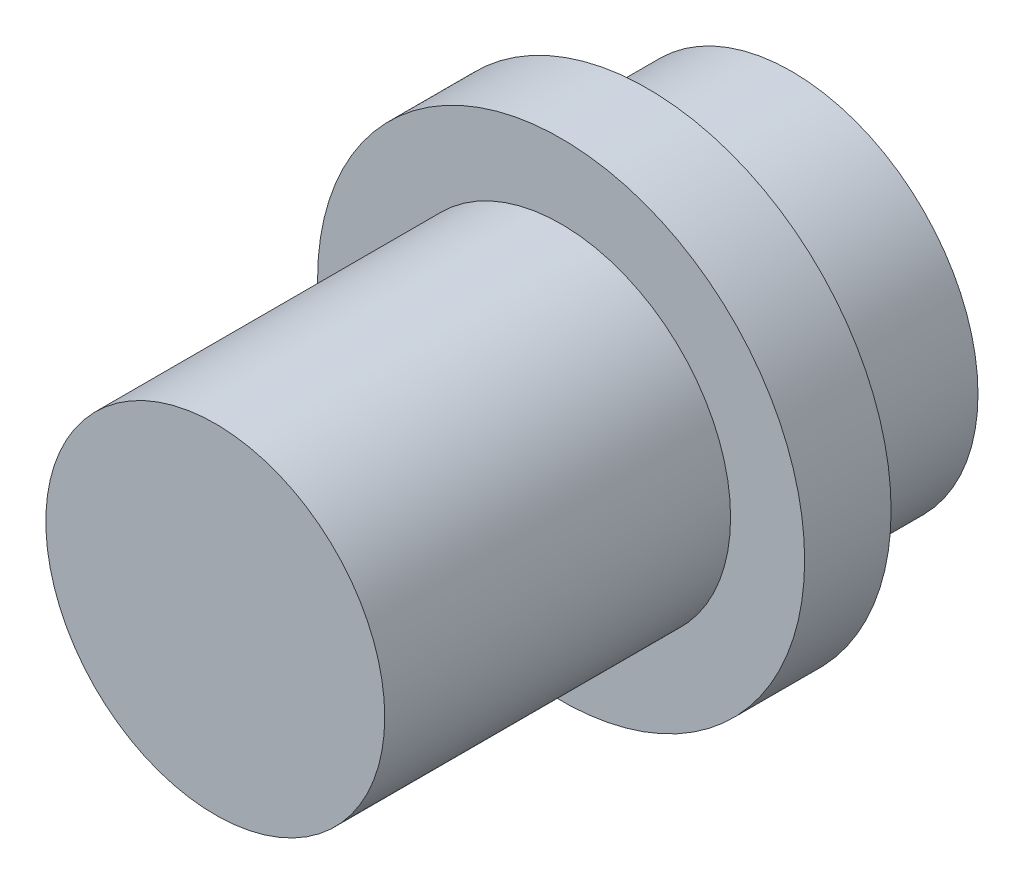
ISO-10303-21;
HEADER;
FILE_DESCRIPTION(('STEP AP214'),'2;1');
FILE_NAME('part.step','',(''),(''),'','','');
FILE_SCHEMA(('AUTOMOTIVE_DESIGN { 1 0 10303 214 1 1 1 1 }'));
ENDSEC;
DATA;
#1=APPLICATION_CONTEXT('core data for automotive mechanical design processes');
#2=APPLICATION_PROTOCOL_DEFINITION('international standard','automotive_design',2000,#1);
#3=PRODUCT_CONTEXT('',#1,'mechanical');
#4=PRODUCT('Part','Part','',(#3));
#5=PRODUCT_RELATED_PRODUCT_CATEGORY('part','',(#4));
#6=PRODUCT_DEFINITION_FORMATION('','',#4);
#7=PRODUCT_DEFINITION_CONTEXT('part definition',#1,'design');
#8=PRODUCT_DEFINITION('design','',#6,#7);
#9=PRODUCT_DEFINITION_SHAPE('','',#8);
#10=(LENGTH_UNIT() NAMED_UNIT(*) SI_UNIT(.MILLI.,.METRE.));
#11=(NAMED_UNIT(*) PLANE_ANGLE_UNIT() SI_UNIT($,.RADIAN.));
#12=(NAMED_UNIT(*) SI_UNIT($,.STERADIAN.) SOLID_ANGLE_UNIT());
#13=UNCERTAINTY_MEASURE_WITH_UNIT(LENGTH_MEASURE(1.E-05),#10,'distance_accuracy_value','');
#14=(GEOMETRIC_REPRESENTATION_CONTEXT(3) GLOBAL_UNCERTAINTY_ASSIGNED_CONTEXT((#13)) GLOBAL_UNIT_ASSIGNED_CONTEXT((#10,
#11,#12)) REPRESENTATION_CONTEXT('',''));
#15=CARTESIAN_POINT('',(0.,0.,0.));
#16=DIRECTION('',(0.,0.,1.));
#17=DIRECTION('',(1.,0.,0.));
#18=AXIS2_PLACEMENT_3D('',#15,#16,#17);
#19=CARTESIAN_POINT('',(0.,0.,12.));
#20=DIRECTION('',(0.,0.,-1.));
#21=DIRECTION('',(-1.,0.,0.));
#22=AXIS2_PLACEMENT_3D('',#19,#20,#21);
#23=CYLINDRICAL_SURFACE('',#22,5.88);
#24=CARTESIAN_POINT('',(0.,0.,12.));
#25=DIRECTION('',(0.,0.,1.));
#26=DIRECTION('',(1.,0.,0.));
#27=AXIS2_PLACEMENT_3D('',#24,#25,#26);
#28=CIRCLE('',#27,5.88);
#29=CARTESIAN_POINT('',(5.88,0.,12.));
#30=VERTEX_POINT('',#29);
#31=EDGE_CURVE('E57',#30,#30,#28,.T.);
#32=ORIENTED_EDGE('',*,*,#31,.F.);
#33=EDGE_LOOP('',(#32));
#34=FACE_BOUND('',#33,.T.);
#35=CARTESIAN_POINT('',(0.,0.,0.));
#36=DIRECTION('',(0.,0.,1.));
#37=DIRECTION('',(1.,0.,0.));
#38=AXIS2_PLACEMENT_3D('',#35,#36,#37);
#39=CIRCLE('',#38,5.88);
#40=CARTESIAN_POINT('',(5.88,0.,0.));
#41=VERTEX_POINT('',#40);
#42=EDGE_CURVE('E52',#41,#41,#39,.T.);
#43=ORIENTED_EDGE('',*,*,#42,.T.);
#44=EDGE_LOOP('',(#43));
#45=FACE_BOUND('',#44,.T.);
#46=ADVANCED_FACE('F49',(#34,#45),#23,.T.);
#47=CARTESIAN_POINT('',(0.,0.,12.));
#48=DIRECTION('',(0.,0.,1.));
#49=DIRECTION('',(1.,0.,0.));
#50=AXIS2_PLACEMENT_3D('',#47,#48,#49);
#51=PLANE('',#50);
#52=ORIENTED_EDGE('',*,*,#31,.T.);
#53=EDGE_LOOP('',(#52));
#54=FACE_BOUND('',#53,.T.);
#55=ADVANCED_FACE('F97',(#54),#51,.T.);
#56=CARTESIAN_POINT('',(0.,0.,-3.));
#57=DIRECTION('',(0.,0.,1.));
#58=DIRECTION('',(1.,0.,0.));
#59=AXIS2_PLACEMENT_3D('',#56,#57,#58);
#60=CYLINDRICAL_SURFACE('',#59,8.45);
#61=CARTESIAN_POINT('',(0.,0.,-3.));
#62=DIRECTION('',(0.,0.,-1.));
#63=DIRECTION('',(-1.,0.,0.));
#64=AXIS2_PLACEMENT_3D('',#61,#62,#63);
#65=CIRCLE('',#64,8.45);
#66=CARTESIAN_POINT('',(-8.45,0.,-3.));
#67=VERTEX_POINT('',#66);
#68=EDGE_CURVE('E66',#67,#67,#65,.T.);
#69=ORIENTED_EDGE('',*,*,#68,.F.);
#70=EDGE_LOOP('',(#69));
#71=FACE_BOUND('',#70,.T.);
#72=CARTESIAN_POINT('',(0.,0.,0.));
#73=DIRECTION('',(0.,0.,-1.));
#74=DIRECTION('',(-1.,0.,0.));
#75=AXIS2_PLACEMENT_3D('',#72,#73,#74);
#76=CIRCLE('',#75,8.45);
#77=CARTESIAN_POINT('',(-8.45,0.,0.));
#78=VERTEX_POINT('',#77);
#79=EDGE_CURVE('E70',#78,#78,#76,.T.);
#80=ORIENTED_EDGE('',*,*,#79,.T.);
#81=EDGE_LOOP('',(#80));
#82=FACE_BOUND('',#81,.T.);
#83=ADVANCED_FACE('F103',(#71,#82),#60,.T.);
#84=CARTESIAN_POINT('',(0.,0.,-3.));
#85=DIRECTION('',(0.,0.,-1.));
#86=DIRECTION('',(-1.,0.,0.));
#87=AXIS2_PLACEMENT_3D('',#84,#85,#86);
#88=PLANE('',#87);
#89=CARTESIAN_POINT('',(0.,0.,-3.));
#90=DIRECTION('',(0.,0.,-1.));
#91=DIRECTION('',(-1.,0.,0.));
#92=AXIS2_PLACEMENT_3D('',#89,#90,#91);
#93=CIRCLE('',#92,6.465);
#94=CARTESIAN_POINT('',(-6.465,0.,-3.));
#95=VERTEX_POINT('',#94);
#96=EDGE_CURVE('E10',#95,#95,#93,.T.);
#97=ORIENTED_EDGE('',*,*,#96,.F.);
#98=EDGE_LOOP('',(#97));
#99=FACE_BOUND('',#98,.T.);
#100=ORIENTED_EDGE('',*,*,#68,.T.);
#101=EDGE_LOOP('',(#100));
#102=FACE_BOUND('',#101,.T.);
#103=ADVANCED_FACE('F92',(#99,#102),#88,.T.);
#104=CARTESIAN_POINT('',(0.,0.,0.));
#105=DIRECTION('',(0.,0.,-1.));
#106=DIRECTION('',(-1.,0.,0.));
#107=AXIS2_PLACEMENT_3D('',#104,#105,#106);
#108=PLANE('',#107);
#109=ORIENTED_EDGE('',*,*,#42,.F.);
#110=EDGE_LOOP('',(#109));
#111=FACE_BOUND('',#110,.T.);
#112=ORIENTED_EDGE('',*,*,#79,.F.);
#113=EDGE_LOOP('',(#112));
#114=FACE_BOUND('',#113,.T.);
#115=ADVANCED_FACE('F83',(#111,#114),#108,.F.);
#116=CARTESIAN_POINT('',(0.,0.,-8.));
#117=DIRECTION('',(0.,0.,1.));
#118=DIRECTION('',(1.,0.,0.));
#119=AXIS2_PLACEMENT_3D('',#116,#117,#118);
#120=CYLINDRICAL_SURFACE('',#119,6.465);
#121=CARTESIAN_POINT('',(0.,0.,-8.));
#122=DIRECTION('',(0.,0.,-1.));
#123=DIRECTION('',(-1.,0.,0.));
#124=AXIS2_PLACEMENT_3D('',#121,#122,#123);
#125=CIRCLE('',#124,6.465);
#126=CARTESIAN_POINT('',(-6.465,0.,-8.));
#127=VERTEX_POINT('',#126);
#128=EDGE_CURVE('E65',#127,#127,#125,.T.);
#129=ORIENTED_EDGE('',*,*,#128,.F.);
#130=EDGE_LOOP('',(#129));
#131=FACE_BOUND('',#130,.T.);
#132=ORIENTED_EDGE('',*,*,#96,.T.);
#133=EDGE_LOOP('',(#132));
#134=FACE_BOUND('',#133,.T.);
#135=ADVANCED_FACE('F81',(#131,#134),#120,.T.);
#136=CARTESIAN_POINT('',(0.,0.,-8.));
#137=DIRECTION('',(0.,0.,-1.));
#138=DIRECTION('',(-1.,0.,0.));
#139=AXIS2_PLACEMENT_3D('',#136,#137,#138);
#140=PLANE('',#139);
#141=ORIENTED_EDGE('',*,*,#128,.T.);
#142=EDGE_LOOP('',(#141));
#143=FACE_BOUND('',#142,.T.);
#144=ADVANCED_FACE('F79',(#143),#140,.T.);
#145=CLOSED_SHELL('',(#46,#55,#83,#103,#115,#135,#144));
#146=MANIFOLD_SOLID_BREP('B2',#145);
#147=ADVANCED_BREP_SHAPE_REPRESENTATION('',(#18,#146),#14);
#148=SHAPE_DEFINITION_REPRESENTATION(#9,#147);
ENDSEC;
END-ISO-10303-21;
